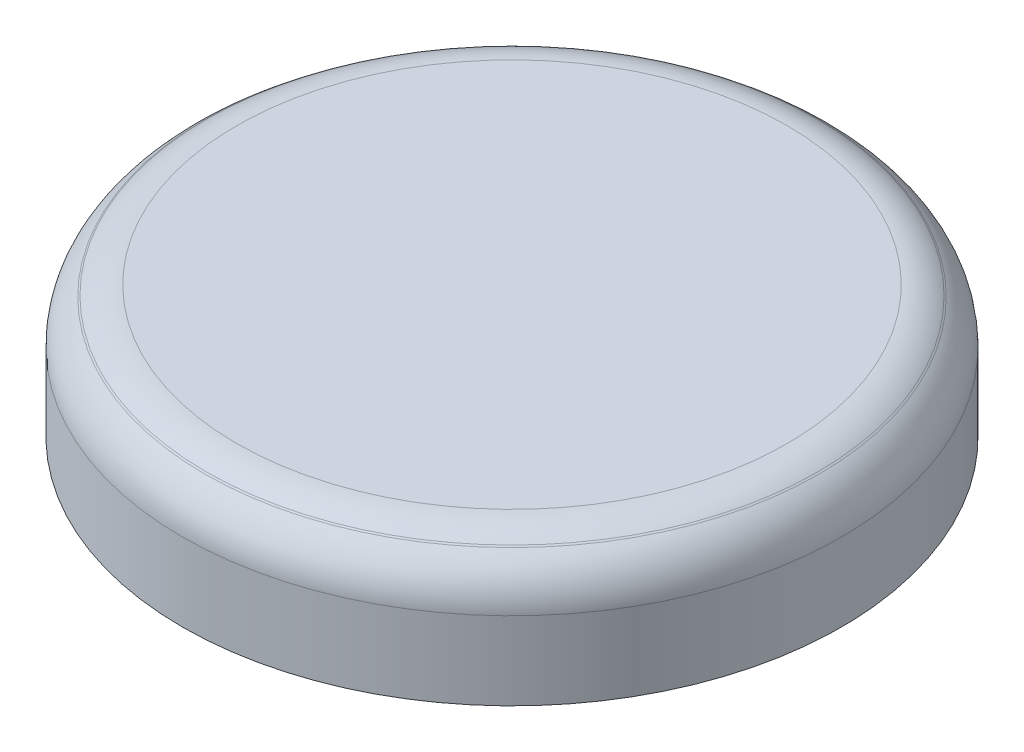
ISO-10303-21;
HEADER;
FILE_DESCRIPTION(('STEP AP214'),'2;1');
FILE_NAME('part.step','',(''),(''),'','','');
FILE_SCHEMA(('AUTOMOTIVE_DESIGN { 1 0 10303 214 1 1 1 1 }'));
ENDSEC;
DATA;
#1=APPLICATION_CONTEXT('core data for automotive mechanical design processes');
#2=APPLICATION_PROTOCOL_DEFINITION('international standard','automotive_design',2000,#1);
#3=PRODUCT_CONTEXT('',#1,'mechanical');
#4=PRODUCT('Part','Part','',(#3));
#5=PRODUCT_RELATED_PRODUCT_CATEGORY('part','',(#4));
#6=PRODUCT_DEFINITION_FORMATION('','',#4);
#7=PRODUCT_DEFINITION_CONTEXT('part definition',#1,'design');
#8=PRODUCT_DEFINITION('design','',#6,#7);
#9=PRODUCT_DEFINITION_SHAPE('','',#8);
#10=(LENGTH_UNIT() NAMED_UNIT(*) SI_UNIT(.MILLI.,.METRE.));
#11=(NAMED_UNIT(*) PLANE_ANGLE_UNIT() SI_UNIT($,.RADIAN.));
#12=(NAMED_UNIT(*) SI_UNIT($,.STERADIAN.) SOLID_ANGLE_UNIT());
#13=UNCERTAINTY_MEASURE_WITH_UNIT(LENGTH_MEASURE(1.E-05),#10,'distance_accuracy_value','');
#14=(GEOMETRIC_REPRESENTATION_CONTEXT(3) GLOBAL_UNCERTAINTY_ASSIGNED_CONTEXT((#13)) GLOBAL_UNIT_ASSIGNED_CONTEXT((#10,
#11,#12)) REPRESENTATION_CONTEXT('',''));
#15=CARTESIAN_POINT('',(0.,0.,0.));
#16=DIRECTION('',(0.,0.,1.));
#17=DIRECTION('',(1.,0.,0.));
#18=AXIS2_PLACEMENT_3D('',#15,#16,#17);
#19=CARTESIAN_POINT('',(0.,5.,0.));
#20=DIRECTION('',(0.,-1.,0.));
#21=DIRECTION('',(0.,0.,-1.));
#22=AXIS2_PLACEMENT_3D('',#19,#20,#21);
#23=CYLINDRICAL_SURFACE('',#22,4.25);
#24=CARTESIAN_POINT('',(0.,0.,0.));
#25=DIRECTION('',(0.,1.,0.));
#26=DIRECTION('',(0.,0.,1.));
#27=AXIS2_PLACEMENT_3D('',#24,#25,#26);
#28=CIRCLE('',#27,4.25);
#29=CARTESIAN_POINT('',(0.,0.,4.25));
#30=VERTEX_POINT('',#29);
#31=EDGE_CURVE('E54',#30,#30,#28,.T.);
#32=ORIENTED_EDGE('',*,*,#31,.F.);
#33=EDGE_LOOP('',(#32));
#34=FACE_BOUND('',#33,.T.);
#35=CARTESIAN_POINT('',(0.,4.,0.));
#36=DIRECTION('',(0.,1.,0.));
#37=DIRECTION('',(0.,0.,1.));
#38=AXIS2_PLACEMENT_3D('',#35,#36,#37);
#39=CIRCLE('',#38,4.25);
#40=CARTESIAN_POINT('',(0.,4.,4.25));
#41=VERTEX_POINT('',#40);
#42=EDGE_CURVE('E57',#41,#41,#39,.T.);
#43=ORIENTED_EDGE('',*,*,#42,.T.);
#44=EDGE_LOOP('',(#43));
#45=FACE_BOUND('',#44,.T.);
#46=ADVANCED_FACE('F31',(#34,#45),#23,.F.);
#47=CARTESIAN_POINT('',(0.,5.,0.));
#48=DIRECTION('',(0.,1.,0.));
#49=DIRECTION('',(0.,0.,1.));
#50=AXIS2_PLACEMENT_3D('',#47,#48,#49);
#51=PLANE('',#50);
#52=CARTESIAN_POINT('',(0.,5.,0.));
#53=DIRECTION('',(0.,1.,0.));
#54=DIRECTION('',(0.,0.,1.));
#55=AXIS2_PLACEMENT_3D('',#52,#53,#54);
#56=CIRCLE('',#55,10.4412544154999);
#57=CARTESIAN_POINT('',(0.,5.,10.4412544154999));
#58=VERTEX_POINT('',#57);
#59=EDGE_CURVE('E46',#58,#58,#56,.T.);
#60=ORIENTED_EDGE('',*,*,#59,.T.);
#61=EDGE_LOOP('',(#60));
#62=FACE_BOUND('',#61,.T.);
#63=ADVANCED_FACE('F98',(#62),#51,.T.);
#64=CARTESIAN_POINT('',(0.,0.,0.));
#65=DIRECTION('',(0.,1.,0.));
#66=DIRECTION('',(0.,0.,1.));
#67=AXIS2_PLACEMENT_3D('',#64,#65,#66);
#68=PLANE('',#67);
#69=CARTESIAN_POINT('',(0.,0.,9.));
#70=DIRECTION('',(0.,-1.,0.));
#71=DIRECTION('',(0.,0.,-1.));
#72=AXIS2_PLACEMENT_3D('',#69,#70,#71);
#73=CIRCLE('',#72,1.25);
#74=CARTESIAN_POINT('',(0.,0.,7.75));
#75=VERTEX_POINT('',#74);
#76=EDGE_CURVE('E79',#75,#75,#73,.T.);
#77=ORIENTED_EDGE('',*,*,#76,.F.);
#78=EDGE_LOOP('',(#77));
#79=FACE_BOUND('',#78,.T.);
#80=CARTESIAN_POINT('',(9.,0.,0.));
#81=DIRECTION('',(0.,-1.,0.));
#82=DIRECTION('',(0.,0.,-1.));
#83=AXIS2_PLACEMENT_3D('',#80,#81,#82);
#84=CIRCLE('',#83,1.25);
#85=CARTESIAN_POINT('',(9.,0.,-1.25));
#86=VERTEX_POINT('',#85);
#87=EDGE_CURVE('E73',#86,#86,#84,.T.);
#88=ORIENTED_EDGE('',*,*,#87,.F.);
#89=EDGE_LOOP('',(#88));
#90=FACE_BOUND('',#89,.T.);
#91=CARTESIAN_POINT('',(0.,0.,-9.));
#92=DIRECTION('',(0.,-1.,0.));
#93=DIRECTION('',(0.,0.,-1.));
#94=AXIS2_PLACEMENT_3D('',#91,#92,#93);
#95=CIRCLE('',#94,1.25);
#96=CARTESIAN_POINT('',(0.,0.,-10.25));
#97=VERTEX_POINT('',#96);
#98=EDGE_CURVE('E67',#97,#97,#95,.T.);
#99=ORIENTED_EDGE('',*,*,#98,.F.);
#100=EDGE_LOOP('',(#99));
#101=FACE_BOUND('',#100,.T.);
#102=CARTESIAN_POINT('',(-9.,0.,0.));
#103=DIRECTION('',(0.,-1.,0.));
#104=DIRECTION('',(0.,0.,-1.));
#105=AXIS2_PLACEMENT_3D('',#102,#103,#104);
#106=CIRCLE('',#105,1.25);
#107=CARTESIAN_POINT('',(-9.,0.,-1.25));
#108=VERTEX_POINT('',#107);
#109=EDGE_CURVE('E61',#108,#108,#106,.T.);
#110=ORIENTED_EDGE('',*,*,#109,.F.);
#111=EDGE_LOOP('',(#110));
#112=FACE_BOUND('',#111,.T.);
#113=CARTESIAN_POINT('',(0.,0.,0.));
#114=DIRECTION('',(0.,1.,0.));
#115=DIRECTION('',(0.,0.,1.));
#116=AXIS2_PLACEMENT_3D('',#113,#114,#115);
#117=CIRCLE('',#116,12.5);
#118=CARTESIAN_POINT('',(0.,0.,12.5));
#119=VERTEX_POINT('',#118);
#120=EDGE_CURVE('E51',#119,#119,#117,.T.);
#121=ORIENTED_EDGE('',*,*,#120,.F.);
#122=EDGE_LOOP('',(#121));
#123=FACE_BOUND('',#122,.T.);
#124=ORIENTED_EDGE('',*,*,#31,.T.);
#125=EDGE_LOOP('',(#124));
#126=FACE_BOUND('',#125,.T.);
#127=ADVANCED_FACE('F94',(#79,#90,#101,#112,#123,#126),#68,.F.);
#128=CARTESIAN_POINT('',(0.,5.,0.));
#129=DIRECTION('',(0.,-1.,0.));
#130=DIRECTION('',(0.,0.,-1.));
#131=AXIS2_PLACEMENT_3D('',#128,#129,#130);
#132=CYLINDRICAL_SURFACE('',#131,12.5);
#133=CARTESIAN_POINT('',(0.,2.95886589889651,0.));
#134=DIRECTION('',(0.,1.,0.));
#135=DIRECTION('',(0.,0.,1.));
#136=AXIS2_PLACEMENT_3D('',#133,#134,#135);
#137=CIRCLE('',#136,12.5);
#138=CARTESIAN_POINT('',(0.,2.95886589889651,12.5));
#139=VERTEX_POINT('',#138);
#140=EDGE_CURVE('E10',#139,#139,#137,.F.);
#141=ORIENTED_EDGE('',*,*,#140,.T.);
#142=EDGE_LOOP('',(#141));
#143=FACE_BOUND('',#142,.T.);
#144=ORIENTED_EDGE('',*,*,#120,.T.);
#145=EDGE_LOOP('',(#144));
#146=FACE_BOUND('',#145,.T.);
#147=ADVANCED_FACE('F97',(#143,#146),#132,.T.);
#148=CARTESIAN_POINT('',(0.,4.,0.));
#149=DIRECTION('',(0.,1.,0.));
#150=DIRECTION('',(0.,0.,1.));
#151=AXIS2_PLACEMENT_3D('',#148,#149,#150);
#152=PLANE('',#151);
#153=ORIENTED_EDGE('',*,*,#42,.F.);
#154=EDGE_LOOP('',(#153));
#155=FACE_BOUND('',#154,.T.);
#156=ADVANCED_FACE('F115',(#155),#152,.F.);
#157=CARTESIAN_POINT('',(-9.,3.,0.));
#158=DIRECTION('',(0.,-1.,0.));
#159=DIRECTION('',(0.,0.,-1.));
#160=AXIS2_PLACEMENT_3D('',#157,#158,#159);
#161=CYLINDRICAL_SURFACE('',#160,1.25);
#162=CARTESIAN_POINT('',(-9.,3.,0.));
#163=DIRECTION('',(0.,-1.,0.));
#164=DIRECTION('',(0.,0.,-1.));
#165=AXIS2_PLACEMENT_3D('',#162,#163,#164);
#166=CIRCLE('',#165,1.25);
#167=CARTESIAN_POINT('',(-9.,3.,-1.25));
#168=VERTEX_POINT('',#167);
#169=EDGE_CURVE('E64',#168,#168,#166,.T.);
#170=ORIENTED_EDGE('',*,*,#169,.F.);
#171=EDGE_LOOP('',(#170));
#172=FACE_BOUND('',#171,.T.);
#173=ORIENTED_EDGE('',*,*,#109,.T.);
#174=EDGE_LOOP('',(#173));
#175=FACE_BOUND('',#174,.T.);
#176=ADVANCED_FACE('F117',(#172,#175),#161,.F.);
#177=CARTESIAN_POINT('',(-9.,3.,0.));
#178=DIRECTION('',(0.,-1.,0.));
#179=DIRECTION('',(0.,0.,-1.));
#180=AXIS2_PLACEMENT_3D('',#177,#178,#179);
#181=PLANE('',#180);
#182=ORIENTED_EDGE('',*,*,#169,.T.);
#183=EDGE_LOOP('',(#182));
#184=FACE_BOUND('',#183,.T.);
#185=ADVANCED_FACE('F123',(#184),#181,.T.);
#186=CARTESIAN_POINT('',(0.,3.,-9.));
#187=DIRECTION('',(0.,-1.,0.));
#188=DIRECTION('',(0.,0.,-1.));
#189=AXIS2_PLACEMENT_3D('',#186,#187,#188);
#190=CYLINDRICAL_SURFACE('',#189,1.25);
#191=CARTESIAN_POINT('',(0.,3.,-9.));
#192=DIRECTION('',(0.,-1.,0.));
#193=DIRECTION('',(0.,0.,-1.));
#194=AXIS2_PLACEMENT_3D('',#191,#192,#193);
#195=CIRCLE('',#194,1.25);
#196=CARTESIAN_POINT('',(0.,3.,-10.25));
#197=VERTEX_POINT('',#196);
#198=EDGE_CURVE('E70',#197,#197,#195,.T.);
#199=ORIENTED_EDGE('',*,*,#198,.F.);
#200=EDGE_LOOP('',(#199));
#201=FACE_BOUND('',#200,.T.);
#202=ORIENTED_EDGE('',*,*,#98,.T.);
#203=EDGE_LOOP('',(#202));
#204=FACE_BOUND('',#203,.T.);
#205=ADVANCED_FACE('F217',(#201,#204),#190,.F.);
#206=CARTESIAN_POINT('',(0.,3.,-9.));
#207=DIRECTION('',(0.,-1.,0.));
#208=DIRECTION('',(0.,0.,-1.));
#209=AXIS2_PLACEMENT_3D('',#206,#207,#208);
#210=PLANE('',#209);
#211=ORIENTED_EDGE('',*,*,#198,.T.);
#212=EDGE_LOOP('',(#211));
#213=FACE_BOUND('',#212,.T.);
#214=ADVANCED_FACE('F207',(#213),#210,.T.);
#215=CARTESIAN_POINT('',(9.,3.,0.));
#216=DIRECTION('',(0.,-1.,0.));
#217=DIRECTION('',(0.,0.,-1.));
#218=AXIS2_PLACEMENT_3D('',#215,#216,#217);
#219=CYLINDRICAL_SURFACE('',#218,1.25);
#220=CARTESIAN_POINT('',(9.,3.,0.));
#221=DIRECTION('',(0.,-1.,0.));
#222=DIRECTION('',(0.,0.,-1.));
#223=AXIS2_PLACEMENT_3D('',#220,#221,#222);
#224=CIRCLE('',#223,1.25);
#225=CARTESIAN_POINT('',(9.,3.,-1.25));
#226=VERTEX_POINT('',#225);
#227=EDGE_CURVE('E76',#226,#226,#224,.T.);
#228=ORIENTED_EDGE('',*,*,#227,.F.);
#229=EDGE_LOOP('',(#228));
#230=FACE_BOUND('',#229,.T.);
#231=ORIENTED_EDGE('',*,*,#87,.T.);
#232=EDGE_LOOP('',(#231));
#233=FACE_BOUND('',#232,.T.);
#234=ADVANCED_FACE('F197',(#230,#233),#219,.F.);
#235=CARTESIAN_POINT('',(9.,3.,0.));
#236=DIRECTION('',(0.,-1.,0.));
#237=DIRECTION('',(0.,0.,-1.));
#238=AXIS2_PLACEMENT_3D('',#235,#236,#237);
#239=PLANE('',#238);
#240=ORIENTED_EDGE('',*,*,#227,.T.);
#241=EDGE_LOOP('',(#240));
#242=FACE_BOUND('',#241,.T.);
#243=ADVANCED_FACE('F90',(#242),#239,.T.);
#244=CARTESIAN_POINT('',(0.,3.,9.));
#245=DIRECTION('',(0.,-1.,0.));
#246=DIRECTION('',(0.,0.,-1.));
#247=AXIS2_PLACEMENT_3D('',#244,#245,#246);
#248=CYLINDRICAL_SURFACE('',#247,1.25);
#249=CARTESIAN_POINT('',(0.,3.,9.));
#250=DIRECTION('',(0.,-1.,0.));
#251=DIRECTION('',(0.,0.,-1.));
#252=AXIS2_PLACEMENT_3D('',#249,#250,#251);
#253=CIRCLE('',#252,1.25);
#254=CARTESIAN_POINT('',(0.,3.,7.75));
#255=VERTEX_POINT('',#254);
#256=EDGE_CURVE('E60',#255,#255,#253,.T.);
#257=ORIENTED_EDGE('',*,*,#256,.F.);
#258=EDGE_LOOP('',(#257));
#259=FACE_BOUND('',#258,.T.);
#260=ORIENTED_EDGE('',*,*,#76,.T.);
#261=EDGE_LOOP('',(#260));
#262=FACE_BOUND('',#261,.T.);
#263=ADVANCED_FACE('F87',(#259,#262),#248,.F.);
#264=CARTESIAN_POINT('',(0.,3.,9.));
#265=DIRECTION('',(0.,-1.,0.));
#266=DIRECTION('',(0.,0.,-1.));
#267=AXIS2_PLACEMENT_3D('',#264,#265,#266);
#268=PLANE('',#267);
#269=ORIENTED_EDGE('',*,*,#256,.T.);
#270=EDGE_LOOP('',(#269));
#271=FACE_BOUND('',#270,.T.);
#272=ADVANCED_FACE('F85',(#271),#268,.T.);
#273=CARTESIAN_POINT('',(0.,5.,0.));
#274=DIRECTION('',(0.,-1.,0.));
#275=DIRECTION('',(0.,0.,-1.));
#276=AXIS2_PLACEMENT_3D('',#273,#274,#275);
#277=CONICAL_SURFACE('',#276,11.0718519932579,0.959931088596879);
#278=CARTESIAN_POINT('',(0.,4.63830408857798,0.));
#279=DIRECTION('',(0.,1.,0.));
#280=DIRECTION('',(0.,0.,1.));
#281=AXIS2_PLACEMENT_3D('',#278,#279,#280);
#282=CIRCLE('',#281,11.588407288202);
#283=CARTESIAN_POINT('',(0.,4.63830408857798,11.588407288202));
#284=VERTEX_POINT('',#283);
#285=EDGE_CURVE('E38',#284,#284,#282,.F.);
#286=ORIENTED_EDGE('',*,*,#285,.T.);
#287=EDGE_LOOP('',(#286));
#288=FACE_BOUND('',#287,.T.);
#289=CARTESIAN_POINT('',(0.,4.59716998747449,0.));
#290=DIRECTION('',(0.,-1.,0.));
#291=DIRECTION('',(0.,0.,-1.));
#292=AXIS2_PLACEMENT_3D('',#289,#290,#291);
#293=CIRCLE('',#292,11.6471528727021);
#294=CARTESIAN_POINT('',(0.,4.59716998747449,-11.6471528727021));
#295=VERTEX_POINT('',#294);
#296=EDGE_CURVE('E42',#295,#295,#293,.F.);
#297=ORIENTED_EDGE('',*,*,#296,.T.);
#298=EDGE_LOOP('',(#297));
#299=FACE_BOUND('',#298,.T.);
#300=ADVANCED_FACE('F132',(#288,#299),#277,.T.);
#301=CARTESIAN_POINT('',(0.,3.,0.));
#302=DIRECTION('',(0.,1.,0.));
#303=DIRECTION('',(0.,0.,1.));
#304=AXIS2_PLACEMENT_3D('',#301,#302,#303);
#305=TOROIDAL_SURFACE('',#304,10.4412544154999,2.);
#306=ORIENTED_EDGE('',*,*,#285,.F.);
#307=EDGE_LOOP('',(#306));
#308=FACE_BOUND('',#307,.T.);
#309=ORIENTED_EDGE('',*,*,#59,.F.);
#310=EDGE_LOOP('',(#309));
#311=FACE_BOUND('',#310,.T.);
#312=ADVANCED_FACE('F134',(#308,#311),#305,.T.);
#313=CARTESIAN_POINT('',(0.,2.95886589889651,0.));
#314=DIRECTION('',(0.,1.,0.));
#315=DIRECTION('',(0.,0.,1.));
#316=AXIS2_PLACEMENT_3D('',#313,#314,#315);
#317=TOROIDAL_SURFACE('',#316,10.5,2.);
#318=ORIENTED_EDGE('',*,*,#296,.F.);
#319=EDGE_LOOP('',(#318));
#320=FACE_BOUND('',#319,.T.);
#321=ORIENTED_EDGE('',*,*,#140,.F.);
#322=EDGE_LOOP('',(#321));
#323=FACE_BOUND('',#322,.T.);
#324=ADVANCED_FACE('F33',(#320,#323),#317,.T.);
#325=CLOSED_SHELL('',(#46,#63,#127,#147,#156,#176,#185,#205,#214,#234,#243,#263,#272,#300,#312,#324));
#326=MANIFOLD_SOLID_BREP('B2',#325);
#327=ADVANCED_BREP_SHAPE_REPRESENTATION('',(#18,#326),#14);
#328=SHAPE_DEFINITION_REPRESENTATION(#9,#327);
ENDSEC;
END-ISO-10303-21;
